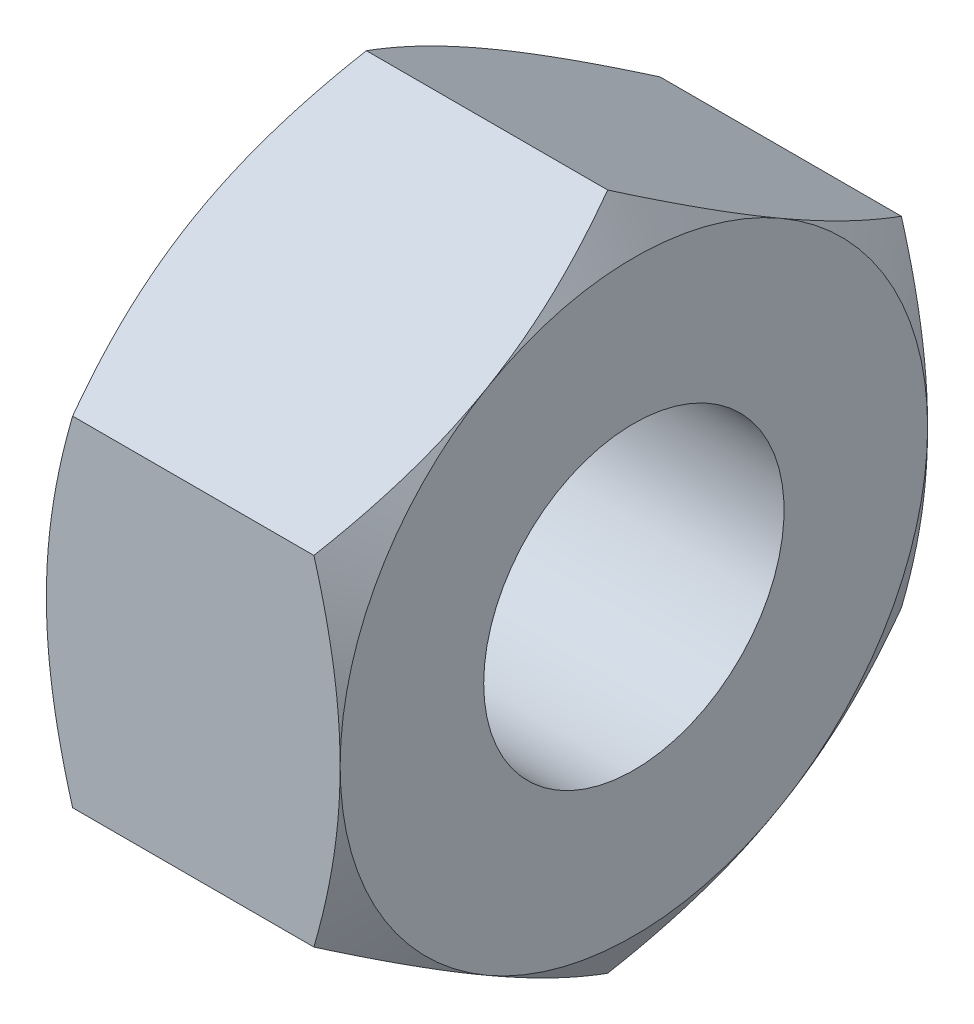
ISO-10303-21;
HEADER;
FILE_DESCRIPTION(('STEP AP214'),'2;1');
FILE_NAME('part.step','',(''),(''),'','','');
FILE_SCHEMA(('AUTOMOTIVE_DESIGN { 1 0 10303 214 1 1 1 1 }'));
ENDSEC;
DATA;
#1=APPLICATION_CONTEXT('core data for automotive mechanical design processes');
#2=APPLICATION_PROTOCOL_DEFINITION('international standard','automotive_design',2000,#1);
#3=PRODUCT_CONTEXT('',#1,'mechanical');
#4=PRODUCT('Part','Part','',(#3));
#5=PRODUCT_RELATED_PRODUCT_CATEGORY('part','',(#4));
#6=PRODUCT_DEFINITION_FORMATION('','',#4);
#7=PRODUCT_DEFINITION_CONTEXT('part definition',#1,'design');
#8=PRODUCT_DEFINITION('design','',#6,#7);
#9=PRODUCT_DEFINITION_SHAPE('','',#8);
#10=(LENGTH_UNIT() NAMED_UNIT(*) SI_UNIT(.MILLI.,.METRE.));
#11=(NAMED_UNIT(*) PLANE_ANGLE_UNIT() SI_UNIT($,.RADIAN.));
#12=(NAMED_UNIT(*) SI_UNIT($,.STERADIAN.) SOLID_ANGLE_UNIT());
#13=UNCERTAINTY_MEASURE_WITH_UNIT(LENGTH_MEASURE(1.E-05),#10,'distance_accuracy_value','');
#14=(GEOMETRIC_REPRESENTATION_CONTEXT(3) GLOBAL_UNCERTAINTY_ASSIGNED_CONTEXT((#13)) GLOBAL_UNIT_ASSIGNED_CONTEXT((#10,
#11,#12)) REPRESENTATION_CONTEXT('',''));
#15=CARTESIAN_POINT('',(0.,0.,0.));
#16=DIRECTION('',(0.,0.,1.));
#17=DIRECTION('',(1.,0.,0.));
#18=AXIS2_PLACEMENT_3D('',#15,#16,#17);
#19=CARTESIAN_POINT('',(6.5,-7.50555349946513,0.));
#20=DIRECTION('',(0.,0.866025403784439,0.5));
#21=DIRECTION('',(0.,-0.5,0.866025403784439));
#22=AXIS2_PLACEMENT_3D('',#19,#20,#21);
#23=PLANE('',#22);
#24=DIRECTION('',(-1.,0.,0.));
#25=VECTOR('',#24,1.);
#26=CARTESIAN_POINT('',(6.5,-3.75277674973257,-6.5));
#27=LINE('',#26,#25);
#28=CARTESIAN_POINT('',(5.91944341639924,-3.75277674973258,-6.5));
#29=VERTEX_POINT('',#28);
#30=CARTESIAN_POINT('',(0.58055658360076,-3.75277674973258,-6.5));
#31=VERTEX_POINT('',#30);
#32=EDGE_CURVE('E168',#29,#31,#27,.T.);
#33=ORIENTED_EDGE('',*,*,#32,.F.);
#34=CARTESIAN_POINT('',(5.91937674819414,-3.75266127967873,-6.5002));
#35=CARTESIAN_POINT('',(5.96699557692452,-3.83515161912751,-6.35732254094112));
#36=CARTESIAN_POINT('',(6.0124532993973,-3.91794952254313,-6.21391236546508));
#37=CARTESIAN_POINT('',(6.09845131797695,-4.08421773795795,-5.9259273686828));
#38=CARTESIAN_POINT('',(6.13898949277197,-4.16768832359106,-5.78135207342873));
#39=CARTESIAN_POINT('',(6.25242899887679,-4.41943655294052,-5.34531134947996));
#40=CARTESIAN_POINT('',(6.31695219287126,-4.5887079340369,-5.05212471715368));
#41=CARTESIAN_POINT('',(6.39261341645251,-4.84201947708215,-4.61337625445562));
#42=CARTESIAN_POINT('',(6.41416714354301,-4.92530276780316,-4.46912536350531));
#43=CARTESIAN_POINT('',(6.45030968539388,-5.09224566542477,-4.17997178286191));
#44=CARTESIAN_POINT('',(6.46489911554033,-5.17590523841628,-4.03506915190111));
#45=CARTESIAN_POINT('',(6.48674124749265,-5.34336968579964,-3.74501222057168));
#46=CARTESIAN_POINT('',(6.49400227567789,-5.427174286676,-3.59985839394579));
#47=CARTESIAN_POINT('',(6.50103969741776,-5.59485627940484,-3.30942466302505));
#48=CARTESIAN_POINT('',(6.50081632218779,-5.6787336689286,-3.16414476276364));
#49=CARTESIAN_POINT('',(6.48991654148483,-5.90853103021317,-2.76612405757351));
#50=CARTESIAN_POINT('',(6.47161818213058,-6.05437578112763,-2.51351353897243));
#51=CARTESIAN_POINT('',(6.41359365854232,-6.34509659313135,-2.00997032176432));
#52=CARTESIAN_POINT('',(6.37384766146175,-6.48997163178545,-1.75903939406692));
#53=CARTESIAN_POINT('',(6.27449409679785,-6.78127752911039,-1.25448277935568));
#54=CARTESIAN_POINT('',(6.21446557436197,-6.92767163007067,-1.00092075856409));
#55=CARTESIAN_POINT('',(6.07822500749013,-7.21827667013277,-0.497578064240954));
#56=CARTESIAN_POINT('',(6.00204496583641,-7.36249133098589,-0.247790944447035));
#57=CARTESIAN_POINT('',(5.91937674819414,-7.50566896951897,0.000200000000000155));
#58=B_SPLINE_CURVE_WITH_KNOTS('',3,(#34,#35,#36,#37,#38,#39,#40,#41,#42,#43,#44,#45,#46,#47,#48,
#49,#50,#51,#52,#53,#54,#55,#56,#57),.UNSPECIFIED.,.F.,.F.,(4,2,2,2,2,2,2,2,2,2,2,4),(0.,
0.515105052395586,1.03043143507524,2.06322554824262,2.56697389547996,3.07067772176453,
3.57380860368927,4.07692394242519,4.9527935470566,5.82947446853466,6.72559912449735,
7.61996451221045),.UNSPECIFIED.);
#59=CARTESIAN_POINT('',(6.5,-5.62916512459885,-3.25));
#60=VERTEX_POINT('',#59);
#61=EDGE_CURVE('E152',#29,#60,#58,.T.);
#62=ORIENTED_EDGE('',*,*,#61,.T.);
#63=CARTESIAN_POINT('',(5.91944341639924,-7.50555349946514,0.));
#64=VERTEX_POINT('',#63);
#65=EDGE_CURVE('E57',#60,#64,#58,.T.);
#66=ORIENTED_EDGE('',*,*,#65,.T.);
#67=DIRECTION('',(-1.,0.,0.));
#68=VECTOR('',#67,1.);
#69=CARTESIAN_POINT('',(6.5,-7.50555349946513,0.));
#70=LINE('',#69,#68);
#71=CARTESIAN_POINT('',(0.58055658360076,-7.50555349946514,0.));
#72=VERTEX_POINT('',#71);
#73=EDGE_CURVE('E163',#64,#72,#70,.T.);
#74=ORIENTED_EDGE('',*,*,#73,.T.);
#75=CARTESIAN_POINT('',(0.580623251805864,-3.75266127967873,-6.5002));
#76=CARTESIAN_POINT('',(0.533004423075483,-3.83515161912751,-6.35732254094112));
#77=CARTESIAN_POINT('',(0.487546700602704,-3.91794952254313,-6.21391236546508));
#78=CARTESIAN_POINT('',(0.401548682023044,-4.08421773795795,-5.9259273686828));
#79=CARTESIAN_POINT('',(0.361010507228024,-4.16768832359106,-5.78135207342873));
#80=CARTESIAN_POINT('',(0.247571001123208,-4.41943655294052,-5.34531134947996));
#81=CARTESIAN_POINT('',(0.18304780712874,-4.5887079340369,-5.05212471715368));
#82=CARTESIAN_POINT('',(0.107386583547493,-4.84201947708215,-4.61337625445563));
#83=CARTESIAN_POINT('',(0.0858328564569899,-4.92530276780316,-4.46912536350531));
#84=CARTESIAN_POINT('',(0.0496903146061218,-5.09224566542477,-4.17997178286191));
#85=CARTESIAN_POINT('',(0.0351008844596692,-5.17590523841628,-4.03506915190111));
#86=CARTESIAN_POINT('',(0.0132587525073493,-5.34336968579964,-3.74501222057168));
#87=CARTESIAN_POINT('',(0.0059977243221104,-5.427174286676,-3.59985839394579));
#88=CARTESIAN_POINT('',(-0.00103969741776594,-5.59485627940484,-3.30942466302505));
#89=CARTESIAN_POINT('',(-0.000816322187792632,-5.6787336689286,-3.16414476276364));
#90=CARTESIAN_POINT('',(0.0100834585151678,-5.90853103021317,-2.76612405757351));
#91=CARTESIAN_POINT('',(0.0283818178694155,-6.05437578112763,-2.51351353897243));
#92=CARTESIAN_POINT('',(0.0864063414576766,-6.34509659313135,-2.00997032176432));
#93=CARTESIAN_POINT('',(0.126152338538246,-6.48997163178544,-1.75903939406692));
#94=CARTESIAN_POINT('',(0.22550590320215,-6.78127752911038,-1.25448277935568));
#95=CARTESIAN_POINT('',(0.285534425638026,-6.92767163007068,-1.00092075856409));
#96=CARTESIAN_POINT('',(0.421774992509866,-7.21827667013277,-0.497578064240955));
#97=CARTESIAN_POINT('',(0.49795503416359,-7.36249133098589,-0.247790944447036));
#98=CARTESIAN_POINT('',(0.580623251805864,-7.50566896951897,0.000200000000000066));
#99=B_SPLINE_CURVE_WITH_KNOTS('',3,(#75,#76,#77,#78,#79,#80,#81,#82,#83,#84,#85,#86,#87,#88,#89,
#90,#91,#92,#93,#94,#95,#96,#97,#98),.UNSPECIFIED.,.F.,.F.,(4,2,2,2,2,2,2,2,2,2,2,4),(0.,
0.515105052395587,1.03043143507524,2.06322554824262,2.56697389547996,3.07067772176453,
3.57380860368927,4.07692394242519,4.95279354705659,5.82947446853466,6.72559912449736,
7.61996451221045),.UNSPECIFIED.);
#100=CARTESIAN_POINT('',(0.,-5.62916512459885,-3.25));
#101=VERTEX_POINT('',#100);
#102=EDGE_CURVE('E208',#101,#72,#99,.T.);
#103=ORIENTED_EDGE('',*,*,#102,.F.);
#104=EDGE_CURVE('E344',#31,#101,#99,.T.);
#105=ORIENTED_EDGE('',*,*,#104,.F.);
#106=EDGE_LOOP('',(#33,#62,#66,#74,#103,#105));
#107=FACE_BOUND('',#106,.T.);
#108=ADVANCED_FACE('F41',(#107),#23,.F.);
#109=CARTESIAN_POINT('',(6.5,-3.75277674973257,-6.5));
#110=DIRECTION('',(0.,0.,1.));
#111=DIRECTION('',(0.,-1.,0.));
#112=AXIS2_PLACEMENT_3D('',#109,#110,#111);
#113=PLANE('',#112);
#114=DIRECTION('',(-1.,0.,0.));
#115=VECTOR('',#114,1.);
#116=CARTESIAN_POINT('',(6.5,3.75277674973257,-6.5));
#117=LINE('',#116,#115);
#118=CARTESIAN_POINT('',(5.91944341639924,3.75277674973257,-6.5));
#119=VERTEX_POINT('',#118);
#120=CARTESIAN_POINT('',(0.58055658360076,3.75277674973257,-6.5));
#121=VERTEX_POINT('',#120);
#122=EDGE_CURVE('E161',#119,#121,#117,.T.);
#123=ORIENTED_EDGE('',*,*,#122,.F.);
#124=CARTESIAN_POINT('',(3.38957529396965,-9.95291930376012,-6.5));
#125=CARTESIAN_POINT('',(3.52748998684855,-9.66753246885864,-6.5));
#126=CARTESIAN_POINT('',(3.66403369342983,-9.38147088338568,-6.5));
#127=CARTESIAN_POINT('',(3.93359570636013,-8.80763337892722,-6.5));
#128=CARTESIAN_POINT('',(4.06661340232531,-8.51985717355029,-6.5));
#129=CARTESIAN_POINT('',(4.32904071112913,-7.94067105260803,-6.5));
#130=CARTESIAN_POINT('',(4.45842532027879,-7.64924976691208,-6.5));
#131=CARTESIAN_POINT('',(4.7116371528739,-7.06401195248325,-6.5));
#132=CARTESIAN_POINT('',(4.8354646660004,-6.77019554954903,-6.5));
#133=CARTESIAN_POINT('',(5.07755469326142,-6.17605277242123,-6.5));
#134=CARTESIAN_POINT('',(5.19573022291758,-5.87569076063596,-6.5));
#135=CARTESIAN_POINT('',(5.42282573681698,-5.27142371161893,-6.5));
#136=CARTESIAN_POINT('',(5.53174469131406,-4.96751828446582,-6.5));
#137=CARTESIAN_POINT('',(5.73740073464719,-4.35630617685149,-6.5));
#138=CARTESIAN_POINT('',(5.83416372207213,-4.04900829883083,-6.5));
#139=CARTESIAN_POINT('',(6.01236415549248,-3.43004071877249,-6.5));
#140=CARTESIAN_POINT('',(6.09380644797263,-3.11837243288824,-6.5));
#141=CARTESIAN_POINT('',(6.23741588566153,-2.49046612743067,-6.5));
#142=CARTESIAN_POINT('',(6.29957789574702,-2.17422691386556,-6.5));
#143=CARTESIAN_POINT('',(6.40042581328225,-1.53789143377902,-6.5));
#144=CARTESIAN_POINT('',(6.43911169999143,-1.21779516385024,-6.5));
#145=CARTESIAN_POINT('',(6.47705347789383,-0.737141364811438,-6.5));
#146=CARTESIAN_POINT('',(6.48635482044178,-0.57733621786633,-6.5));
#147=CARTESIAN_POINT('',(6.49818593157456,-0.257468096283207,-6.5));
#148=CARTESIAN_POINT('',(6.50071578809664,-0.0974051250204134,-6.5));
#149=CARTESIAN_POINT('',(6.49893596916745,0.22263646387025,-6.5));
#150=CARTESIAN_POINT('',(6.49462821320877,0.382615092564559,-6.5));
#151=CARTESIAN_POINT('',(6.47928234207001,0.702251865778322,-6.5));
#152=CARTESIAN_POINT('',(6.46824389078513,0.861909993893739,-6.5));
#153=CARTESIAN_POINT('',(6.43356297867546,1.24887194369331,-6.5));
#154=CARTESIAN_POINT('',(6.40654793642438,1.47587839735562,-6.5));
#155=CARTESIAN_POINT('',(6.34040986127076,1.92815183530151,-6.5));
#156=CARTESIAN_POINT('',(6.30128352350825,2.15341832757691,-6.5));
#157=CARTESIAN_POINT('',(6.21231047705942,2.60202592242475,-6.5));
#158=CARTESIAN_POINT('',(6.16245363219179,2.82536499541634,-6.5));
#159=CARTESIAN_POINT('',(6.05354078051894,3.26974530346816,-6.5));
#160=CARTESIAN_POINT('',(5.99448564031908,3.49078675290536,-6.5));
#161=CARTESIAN_POINT('',(5.86704532562959,3.9360160111231,-6.5));
#162=CARTESIAN_POINT('',(5.79846693486802,4.16014813207211,-6.5));
#163=CARTESIAN_POINT('',(5.65453421659787,4.60604329209093,-6.5));
#164=CARTESIAN_POINT('',(5.5791845627256,4.8278078487957,-6.5));
#165=CARTESIAN_POINT('',(5.42326573854341,5.26807801966739,-6.5));
#166=CARTESIAN_POINT('',(5.34272833440761,5.4865949514202,-6.49999999999999));
#167=CARTESIAN_POINT('',(5.17692644198966,5.921933426937,-6.49999999999999));
#168=CARTESIAN_POINT('',(5.09166004317997,6.13875424450297,-6.49999999999999));
#169=CARTESIAN_POINT('',(5.00449694910844,6.35478737621633,-6.49999999999999));
#170=B_SPLINE_CURVE_WITH_KNOTS('',3,(#124,#125,#126,#127,#128,#129,#130,#131,#132,#133,#134,
#135,#136,#137,#138,#139,#140,#141,#142,#143,#144,#145,#146,#147,#148,#149,#150,#151,#152,#153,
#154,#155,#156,#157,#158,#159,#160,#161,#162,#163,#164,#165,#166,#167,#168,#169),.UNSPECIFIED.,
.F.,.F.,(4,2,2,2,2,2,2,2,2,2,2,2,2,2,2,2,2,2,2,2,2,2,4),(0.,0.950904440030122,1.90197242910012,
2.85848299779176,3.81494364731855,4.78314666613984,5.75145725194119,6.71766851991497,
7.68357362477188,8.64973576896117,9.61589876672907,10.0960037028175,10.5761024040381,
11.0560663531158,11.5360542716923,12.2214972563459,12.9071274458287,13.5934081558082,
14.2796242478146,14.9826609808827,15.685216139834,16.3838168457429,17.0827018739316),.UNSPECIFIED.);
#171=CARTESIAN_POINT('',(6.5,0.,-6.5));
#172=VERTEX_POINT('',#171);
#173=EDGE_CURVE('E285',#119,#172,#170,.F.);
#174=ORIENTED_EDGE('',*,*,#173,.T.);
#175=EDGE_CURVE('E141',#172,#29,#170,.F.);
#176=ORIENTED_EDGE('',*,*,#175,.T.);
#177=ORIENTED_EDGE('',*,*,#32,.T.);
#178=CARTESIAN_POINT('',(3.11042470603036,-9.95291930376012,-6.5));
#179=CARTESIAN_POINT('',(2.97251001315146,-9.66753246885864,-6.5));
#180=CARTESIAN_POINT('',(2.83596630657017,-9.38147088338568,-6.5));
#181=CARTESIAN_POINT('',(2.56640429363987,-8.80763337892722,-6.5));
#182=CARTESIAN_POINT('',(2.4333865976747,-8.51985717355028,-6.5));
#183=CARTESIAN_POINT('',(2.17095928887087,-7.94067105260803,-6.5));
#184=CARTESIAN_POINT('',(2.04157467972122,-7.64924976691208,-6.5));
#185=CARTESIAN_POINT('',(1.7883628471261,-7.06401195248325,-6.5));
#186=CARTESIAN_POINT('',(1.6645353339996,-6.77019554954903,-6.5));
#187=CARTESIAN_POINT('',(1.42244530673858,-6.17605277242123,-6.5));
#188=CARTESIAN_POINT('',(1.30426977708242,-5.87569076063596,-6.5));
#189=CARTESIAN_POINT('',(1.07717426318302,-5.27142371161893,-6.5));
#190=CARTESIAN_POINT('',(0.968255308685941,-4.96751828446582,-6.5));
#191=CARTESIAN_POINT('',(0.762599265352815,-4.35630617685149,-6.5));
#192=CARTESIAN_POINT('',(0.665836277927869,-4.04900829883083,-6.5));
#193=CARTESIAN_POINT('',(0.487635844507524,-3.43004071877249,-6.5));
#194=CARTESIAN_POINT('',(0.406193552027366,-3.11837243288824,-6.5));
#195=CARTESIAN_POINT('',(0.262584114338473,-2.49046612743067,-6.5));
#196=CARTESIAN_POINT('',(0.200422104252976,-2.17422691386556,-6.5));
#197=CARTESIAN_POINT('',(0.0995741867177449,-1.53789143377902,-6.5));
#198=CARTESIAN_POINT('',(0.0608883000085734,-1.21779516385024,-6.5));
#199=CARTESIAN_POINT('',(0.0229465221061728,-0.737141364811437,-6.5));
#200=CARTESIAN_POINT('',(0.0136451795582183,-0.577336217866329,-6.5));
#201=CARTESIAN_POINT('',(0.00181406842544267,-0.257468096283205,-6.5));
#202=CARTESIAN_POINT('',(-0.000715788096643417,-0.0974051250204121,-6.5));
#203=CARTESIAN_POINT('',(0.00106403083255105,0.222636463870252,-6.5));
#204=CARTESIAN_POINT('',(0.00537178679122571,0.382615092564561,-6.5));
#205=CARTESIAN_POINT('',(0.0207176579299883,0.702251865778323,-6.5));
#206=CARTESIAN_POINT('',(0.031756109214864,0.861909993893741,-6.5));
#207=CARTESIAN_POINT('',(0.0664370213245354,1.24887194369331,-6.5));
#208=CARTESIAN_POINT('',(0.0934520635756201,1.47587839735562,-6.5));
#209=CARTESIAN_POINT('',(0.159590138729237,1.92815183530151,-6.5));
#210=CARTESIAN_POINT('',(0.198716476491744,2.1534183275769,-6.5));
#211=CARTESIAN_POINT('',(0.287689522940582,2.60202592242474,-6.5));
#212=CARTESIAN_POINT('',(0.337546367808207,2.82536499541633,-6.5));
#213=CARTESIAN_POINT('',(0.446459219481053,3.26974530346815,-6.5));
#214=CARTESIAN_POINT('',(0.50551435968092,3.49078675290535,-6.5));
#215=CARTESIAN_POINT('',(0.632954674370406,3.93601601112309,-6.5));
#216=CARTESIAN_POINT('',(0.701533065131981,4.1601481320721,-6.5));
#217=CARTESIAN_POINT('',(0.845465783402124,4.60604329209092,-6.5));
#218=CARTESIAN_POINT('',(0.920815437274398,4.82780784879568,-6.5));
#219=CARTESIAN_POINT('',(1.07673426145659,5.26807801966737,-6.5));
#220=CARTESIAN_POINT('',(1.15727166559238,5.48659495142018,-6.49999999999999));
#221=CARTESIAN_POINT('',(1.32307355801033,5.92193342693698,-6.49999999999999));
#222=CARTESIAN_POINT('',(1.40833995682003,6.13875424450295,-6.49999999999999));
#223=CARTESIAN_POINT('',(1.49550305089155,6.35478737621631,-6.49999999999999));
#224=B_SPLINE_CURVE_WITH_KNOTS('',3,(#178,#179,#180,#181,#182,#183,#184,#185,#186,#187,#188,
#189,#190,#191,#192,#193,#194,#195,#196,#197,#198,#199,#200,#201,#202,#203,#204,#205,#206,#207,
#208,#209,#210,#211,#212,#213,#214,#215,#216,#217,#218,#219,#220,#221,#222,#223),.UNSPECIFIED.,
.F.,.F.,(4,2,2,2,2,2,2,2,2,2,2,2,2,2,2,2,2,2,2,2,2,2,4),(0.,0.950904440030123,1.90197242910012,
2.85848299779176,3.81494364731856,4.78314666613984,5.75145725194119,6.71766851991497,
7.68357362477189,8.64973576896118,9.61589876672908,10.0960037028175,10.5761024040381,
11.0560663531158,11.5360542716923,12.2214972563459,12.9071274458287,13.5934081558082,
14.2796242478146,14.9826609808827,15.685216139834,16.3838168457429,17.0827018739316),.UNSPECIFIED.);
#225=CARTESIAN_POINT('',(0.,0.,-6.5));
#226=VERTEX_POINT('',#225);
#227=EDGE_CURVE('E260',#226,#31,#224,.F.);
#228=ORIENTED_EDGE('',*,*,#227,.F.);
#229=EDGE_CURVE('E265',#121,#226,#224,.F.);
#230=ORIENTED_EDGE('',*,*,#229,.F.);
#231=EDGE_LOOP('',(#123,#174,#176,#177,#228,#230));
#232=FACE_BOUND('',#231,.T.);
#233=ADVANCED_FACE('F272',(#232),#113,.F.);
#234=CARTESIAN_POINT('',(6.5,3.75277674973257,-6.5));
#235=DIRECTION('',(0.,-0.866025403784439,0.5));
#236=DIRECTION('',(0.,-0.5,-0.866025403784439));
#237=AXIS2_PLACEMENT_3D('',#234,#235,#236);
#238=PLANE('',#237);
#239=DIRECTION('',(-1.,0.,0.));
#240=VECTOR('',#239,1.);
#241=CARTESIAN_POINT('',(6.5,7.50555349946514,0.));
#242=LINE('',#241,#240);
#243=CARTESIAN_POINT('',(5.91944341639924,7.50555349946514,0.));
#244=VERTEX_POINT('',#243);
#245=CARTESIAN_POINT('',(0.58055658360076,7.50555349946514,0.));
#246=VERTEX_POINT('',#245);
#247=EDGE_CURVE('E158',#244,#246,#242,.T.);
#248=ORIENTED_EDGE('',*,*,#247,.F.);
#249=CARTESIAN_POINT('',(5.91937674819414,7.50566896951897,0.000200000000000071));
#250=CARTESIAN_POINT('',(5.96699557692452,7.4231786300702,-0.14267745905888));
#251=CARTESIAN_POINT('',(6.0124532993973,7.34038072665458,-0.286087634534913));
#252=CARTESIAN_POINT('',(6.09845131797695,7.17411251123976,-0.574072631317194));
#253=CARTESIAN_POINT('',(6.13898949277197,7.09064192560665,-0.718647926571263));
#254=CARTESIAN_POINT('',(6.25242899887679,6.83889369625719,-1.15468865052003));
#255=CARTESIAN_POINT('',(6.31695219287126,6.66962231516081,-1.44787528284632));
#256=CARTESIAN_POINT('',(6.39261341645251,6.41631077211555,-1.88662374554437));
#257=CARTESIAN_POINT('',(6.41416714354301,6.33302748139455,-2.03087463649469));
#258=CARTESIAN_POINT('',(6.45030968539388,6.16608458377294,-2.32002821713809));
#259=CARTESIAN_POINT('',(6.46489911554033,6.08242501078143,-2.46493084809889));
#260=CARTESIAN_POINT('',(6.48674124749265,5.91496056339807,-2.75498777942832));
#261=CARTESIAN_POINT('',(6.49400227567789,5.83115596252171,-2.90014160605421));
#262=CARTESIAN_POINT('',(6.50103969741776,5.66347396979287,-3.19057533697494));
#263=CARTESIAN_POINT('',(6.50081632218779,5.5795965802691,-3.33585523723635));
#264=CARTESIAN_POINT('',(6.48991654148483,5.34979921898454,-3.73387594242649));
#265=CARTESIAN_POINT('',(6.47161818213058,5.20395446807007,-3.98648646102757));
#266=CARTESIAN_POINT('',(6.41359365854232,4.91323365606636,-4.49002967823567));
#267=CARTESIAN_POINT('',(6.37384766146175,4.76835861741226,-4.74096060593308));
#268=CARTESIAN_POINT('',(6.27449409679785,4.47705272008732,-5.24551722064432));
#269=CARTESIAN_POINT('',(6.21446557436197,4.33065861912703,-5.49907924143591));
#270=CARTESIAN_POINT('',(6.07822500749013,4.04005357906494,-6.00242193575904));
#271=CARTESIAN_POINT('',(6.00204496583641,3.89583891821182,-6.25220905555296));
#272=CARTESIAN_POINT('',(5.91937674819414,3.75266127967873,-6.50019999999999));
#273=B_SPLINE_CURVE_WITH_KNOTS('',3,(#249,#250,#251,#252,#253,#254,#255,#256,#257,#258,#259,
#260,#261,#262,#263,#264,#265,#266,#267,#268,#269,#270,#271,#272),.UNSPECIFIED.,.F.,.F.,(4,2,2,
2,2,2,2,2,2,2,2,4),(0.,0.515105052395587,1.03043143507524,2.06322554824262,2.56697389547996,
3.07067772176453,3.57380860368927,4.07692394242519,4.95279354705659,5.82947446853465,
6.72559912449735,7.61996451221045),.UNSPECIFIED.);
#274=CARTESIAN_POINT('',(6.5,5.62916512459885,-3.25));
#275=VERTEX_POINT('',#274);
#276=EDGE_CURVE('E214',#244,#275,#273,.T.);
#277=ORIENTED_EDGE('',*,*,#276,.T.);
#278=EDGE_CURVE('E291',#275,#119,#273,.T.);
#279=ORIENTED_EDGE('',*,*,#278,.T.);
#280=ORIENTED_EDGE('',*,*,#122,.T.);
#281=CARTESIAN_POINT('',(0.580623251805864,7.50566896951897,0.0002000000000001));
#282=CARTESIAN_POINT('',(0.533004423075483,7.4231786300702,-0.14267745905888));
#283=CARTESIAN_POINT('',(0.487546700602704,7.34038072665458,-0.286087634534913));
#284=CARTESIAN_POINT('',(0.401548682023045,7.17411251123976,-0.574072631317195));
#285=CARTESIAN_POINT('',(0.361010507228025,7.09064192560665,-0.718647926571264));
#286=CARTESIAN_POINT('',(0.247571001123209,6.83889369625719,-1.15468865052003));
#287=CARTESIAN_POINT('',(0.18304780712874,6.66962231516081,-1.44787528284632));
#288=CARTESIAN_POINT('',(0.107386583547493,6.41631077211555,-1.88662374554437));
#289=CARTESIAN_POINT('',(0.0858328564569888,6.33302748139454,-2.03087463649469));
#290=CARTESIAN_POINT('',(0.0496903146061209,6.16608458377293,-2.32002821713809));
#291=CARTESIAN_POINT('',(0.035100884459669,6.08242501078143,-2.46493084809889));
#292=CARTESIAN_POINT('',(0.0132587525073496,5.91496056339807,-2.75498777942832));
#293=CARTESIAN_POINT('',(0.00599772432211049,5.8311559625217,-2.90014160605421));
#294=CARTESIAN_POINT('',(-0.00103969741776601,5.66347396979287,-3.19057533697495));
#295=CARTESIAN_POINT('',(-0.00081632218779273,5.5795965802691,-3.33585523723636));
#296=CARTESIAN_POINT('',(0.0100834585151677,5.34979921898453,-3.73387594242649));
#297=CARTESIAN_POINT('',(0.0283818178694154,5.20395446807007,-3.98648646102757));
#298=CARTESIAN_POINT('',(0.0864063414576762,4.91323365606636,-4.49002967823568));
#299=CARTESIAN_POINT('',(0.126152338538245,4.76835861741226,-4.74096060593308));
#300=CARTESIAN_POINT('',(0.225505903202149,4.47705272008732,-5.24551722064432));
#301=CARTESIAN_POINT('',(0.285534425638025,4.33065861912703,-5.49907924143591));
#302=CARTESIAN_POINT('',(0.421774992509866,4.04005357906494,-6.00242193575904));
#303=CARTESIAN_POINT('',(0.497955034163589,3.89583891821182,-6.25220905555296));
#304=CARTESIAN_POINT('',(0.580623251805863,3.75266127967873,-6.5002));
#305=B_SPLINE_CURVE_WITH_KNOTS('',3,(#281,#282,#283,#284,#285,#286,#287,#288,#289,#290,#291,
#292,#293,#294,#295,#296,#297,#298,#299,#300,#301,#302,#303,#304),.UNSPECIFIED.,.F.,.F.,(4,2,2,
2,2,2,2,2,2,2,2,4),(0.,0.515105052395587,1.03043143507524,2.06322554824262,2.56697389547996,
3.07067772176453,3.57380860368927,4.0769239424252,4.9527935470566,5.82947446853466,
6.72559912449736,7.61996451221045),.UNSPECIFIED.);
#306=CARTESIAN_POINT('',(0.,5.62916512459885,-3.25));
#307=VERTEX_POINT('',#306);
#308=EDGE_CURVE('E266',#307,#121,#305,.T.);
#309=ORIENTED_EDGE('',*,*,#308,.F.);
#310=EDGE_CURVE('E352',#246,#307,#305,.T.);
#311=ORIENTED_EDGE('',*,*,#310,.F.);
#312=EDGE_LOOP('',(#248,#277,#279,#280,#309,#311));
#313=FACE_BOUND('',#312,.T.);
#314=ADVANCED_FACE('F275',(#313),#238,.F.);
#315=CARTESIAN_POINT('',(6.5,7.50555349946514,0.));
#316=DIRECTION('',(0.,-0.866025403784439,-0.5));
#317=DIRECTION('',(0.,0.5,-0.866025403784439));
#318=AXIS2_PLACEMENT_3D('',#315,#316,#317);
#319=PLANE('',#318);
#320=DIRECTION('',(-1.,0.,0.));
#321=VECTOR('',#320,1.);
#322=CARTESIAN_POINT('',(6.5,3.75277674973257,6.5));
#323=LINE('',#322,#321);
#324=CARTESIAN_POINT('',(5.91944341639924,3.75277674973257,6.5));
#325=VERTEX_POINT('',#324);
#326=CARTESIAN_POINT('',(0.58055658360076,3.75277674973257,6.5));
#327=VERTEX_POINT('',#326);
#328=EDGE_CURVE('E149',#325,#327,#323,.T.);
#329=ORIENTED_EDGE('',*,*,#328,.F.);
#330=CARTESIAN_POINT('',(5.91937674819414,3.75266127967873,6.5002));
#331=CARTESIAN_POINT('',(5.96699557692452,3.83515161912751,6.35732254094112));
#332=CARTESIAN_POINT('',(6.0124532993973,3.91794952254312,6.21391236546509));
#333=CARTESIAN_POINT('',(6.09845131797695,4.08421773795795,5.92592736868281));
#334=CARTESIAN_POINT('',(6.13898949277197,4.16768832359106,5.78135207342874));
#335=CARTESIAN_POINT('',(6.25242899887679,4.41943655294052,5.34531134947997));
#336=CARTESIAN_POINT('',(6.31695219287126,4.5887079340369,5.05212471715368));
#337=CARTESIAN_POINT('',(6.3926134164525,4.84201947708215,4.61337625445563));
#338=CARTESIAN_POINT('',(6.41416714354301,4.92530276780316,4.46912536350531));
#339=CARTESIAN_POINT('',(6.45030968539388,5.09224566542477,4.17997178286191));
#340=CARTESIAN_POINT('',(6.46489911554033,5.17590523841627,4.03506915190111));
#341=CARTESIAN_POINT('',(6.48674124749265,5.34336968579964,3.74501222057168));
#342=CARTESIAN_POINT('',(6.49400227567789,5.427174286676,3.59985839394579));
#343=CARTESIAN_POINT('',(6.50103969741776,5.59485627940484,3.30942466302505));
#344=CARTESIAN_POINT('',(6.50081632218779,5.6787336689286,3.16414476276365));
#345=CARTESIAN_POINT('',(6.48991654148483,5.90853103021317,2.76612405757351));
#346=CARTESIAN_POINT('',(6.47161818213058,6.05437578112763,2.51351353897243));
#347=CARTESIAN_POINT('',(6.41359365854232,6.34509659313135,2.00997032176432));
#348=CARTESIAN_POINT('',(6.37384766146175,6.48997163178544,1.75903939406692));
#349=CARTESIAN_POINT('',(6.27449409679785,6.78127752911038,1.25448277935568));
#350=CARTESIAN_POINT('',(6.21446557436197,6.92767163007067,1.00092075856409));
#351=CARTESIAN_POINT('',(6.07822500749013,7.21827667013277,0.497578064240957));
#352=CARTESIAN_POINT('',(6.00204496583641,7.36249133098589,0.247790944447037));
#353=CARTESIAN_POINT('',(5.91937674819414,7.50566896951897,-0.000199999999999004));
#354=B_SPLINE_CURVE_WITH_KNOTS('',3,(#330,#331,#332,#333,#334,#335,#336,#337,#338,#339,#340,
#341,#342,#343,#344,#345,#346,#347,#348,#349,#350,#351,#352,#353),.UNSPECIFIED.,.F.,.F.,(4,2,2,
2,2,2,2,2,2,2,2,4),(0.,0.515105052395586,1.03043143507524,2.06322554824262,2.56697389547996,
3.07067772176453,3.57380860368927,4.07692394242519,4.9527935470566,5.82947446853466,
6.72559912449736,7.61996451221045),.UNSPECIFIED.);
#355=CARTESIAN_POINT('',(6.5,5.62916512459885,3.25));
#356=VERTEX_POINT('',#355);
#357=EDGE_CURVE('E131',#325,#356,#354,.T.);
#358=ORIENTED_EDGE('',*,*,#357,.T.);
#359=EDGE_CURVE('E143',#356,#244,#354,.T.);
#360=ORIENTED_EDGE('',*,*,#359,.T.);
#361=ORIENTED_EDGE('',*,*,#247,.T.);
#362=CARTESIAN_POINT('',(0.580623251805865,3.75266127967873,6.5002));
#363=CARTESIAN_POINT('',(0.533004423075483,3.83515161912751,6.35732254094112));
#364=CARTESIAN_POINT('',(0.487546700602705,3.91794952254313,6.21391236546509));
#365=CARTESIAN_POINT('',(0.401548682023045,4.08421773795795,5.9259273686828));
#366=CARTESIAN_POINT('',(0.361010507228025,4.16768832359106,5.78135207342874));
#367=CARTESIAN_POINT('',(0.247571001123209,4.41943655294052,5.34531134947997));
#368=CARTESIAN_POINT('',(0.183047807128741,4.5887079340369,5.05212471715368));
#369=CARTESIAN_POINT('',(0.107386583547494,4.84201947708215,4.61337625445563));
#370=CARTESIAN_POINT('',(0.0858328564569903,4.92530276780316,4.46912536350531));
#371=CARTESIAN_POINT('',(0.0496903146061219,5.09224566542477,4.17997178286191));
#372=CARTESIAN_POINT('',(0.0351008844596694,5.17590523841628,4.03506915190111));
#373=CARTESIAN_POINT('',(0.0132587525073497,5.34336968579964,3.74501222057168));
#374=CARTESIAN_POINT('',(0.005997724322111,5.427174286676,3.59985839394579));
#375=CARTESIAN_POINT('',(-0.00103969741776528,5.59485627940484,3.30942466302505));
#376=CARTESIAN_POINT('',(-0.000816322187792131,5.6787336689286,3.16414476276364));
#377=CARTESIAN_POINT('',(0.010083458515168,5.90853103021317,2.76612405757351));
#378=CARTESIAN_POINT('',(0.0283818178694157,6.05437578112763,2.51351353897243));
#379=CARTESIAN_POINT('',(0.0864063414576769,6.34509659313135,2.00997032176432));
#380=CARTESIAN_POINT('',(0.126152338538246,6.48997163178545,1.75903939406692));
#381=CARTESIAN_POINT('',(0.22550590320215,6.78127752911039,1.25448277935568));
#382=CARTESIAN_POINT('',(0.285534425638027,6.92767163007068,1.00092075856409));
#383=CARTESIAN_POINT('',(0.421774992509867,7.21827667013277,0.497578064240954));
#384=CARTESIAN_POINT('',(0.497955034163591,7.36249133098589,0.247790944447035));
#385=CARTESIAN_POINT('',(0.580623251805865,7.50566896951897,-0.000200000000000924));
#386=B_SPLINE_CURVE_WITH_KNOTS('',3,(#362,#363,#364,#365,#366,#367,#368,#369,#370,#371,#372,
#373,#374,#375,#376,#377,#378,#379,#380,#381,#382,#383,#384,#385),.UNSPECIFIED.,.F.,.F.,(4,2,2,
2,2,2,2,2,2,2,2,4),(0.,0.515105052395588,1.03043143507524,2.06322554824262,2.56697389547996,
3.07067772176453,3.57380860368927,4.0769239424252,4.9527935470566,5.82947446853466,
6.72559912449736,7.61996451221046),.UNSPECIFIED.);
#387=CARTESIAN_POINT('',(0.,5.62916512459885,3.25));
#388=VERTEX_POINT('',#387);
#389=EDGE_CURVE('E350',#388,#246,#386,.T.);
#390=ORIENTED_EDGE('',*,*,#389,.F.);
#391=EDGE_CURVE('E157',#327,#388,#386,.T.);
#392=ORIENTED_EDGE('',*,*,#391,.F.);
#393=EDGE_LOOP('',(#329,#358,#360,#361,#390,#392));
#394=FACE_BOUND('',#393,.T.);
#395=ADVANCED_FACE('F155',(#394),#319,.F.);
#396=CARTESIAN_POINT('',(6.5,3.75277674973257,6.5));
#397=DIRECTION('',(0.,0.,-1.));
#398=DIRECTION('',(0.,1.,0.));
#399=AXIS2_PLACEMENT_3D('',#396,#397,#398);
#400=PLANE('',#399);
#401=DIRECTION('',(-1.,0.,0.));
#402=VECTOR('',#401,1.);
#403=CARTESIAN_POINT('',(6.5,-3.75277674973257,6.5));
#404=LINE('',#403,#402);
#405=CARTESIAN_POINT('',(5.91944341639924,-3.75277674973257,6.5));
#406=VERTEX_POINT('',#405);
#407=CARTESIAN_POINT('',(0.58055658360076,-3.75277674973257,6.5));
#408=VERTEX_POINT('',#407);
#409=EDGE_CURVE('E159',#406,#408,#404,.T.);
#410=ORIENTED_EDGE('',*,*,#409,.F.);
#411=CARTESIAN_POINT('',(3.38957529396965,-9.95291930376012,6.5));
#412=CARTESIAN_POINT('',(3.52748998684855,-9.66753246885864,6.5));
#413=CARTESIAN_POINT('',(3.66403369342983,-9.38147088338568,6.5));
#414=CARTESIAN_POINT('',(3.93359570636013,-8.80763337892722,6.5));
#415=CARTESIAN_POINT('',(4.06661340232531,-8.51985717355028,6.5));
#416=CARTESIAN_POINT('',(4.32904071112913,-7.94067105260803,6.5));
#417=CARTESIAN_POINT('',(4.45842532027879,-7.64924976691208,6.5));
#418=CARTESIAN_POINT('',(4.7116371528739,-7.06401195248325,6.5));
#419=CARTESIAN_POINT('',(4.8354646660004,-6.77019554954903,6.5));
#420=CARTESIAN_POINT('',(5.07755469326142,-6.17605277242122,6.5));
#421=CARTESIAN_POINT('',(5.19573022291758,-5.87569076063596,6.5));
#422=CARTESIAN_POINT('',(5.42282573681698,-5.27142371161893,6.5));
#423=CARTESIAN_POINT('',(5.53174469131406,-4.96751828446581,6.5));
#424=CARTESIAN_POINT('',(5.73740073464718,-4.35630617685149,6.5));
#425=CARTESIAN_POINT('',(5.83416372207213,-4.04900829883083,6.5));
#426=CARTESIAN_POINT('',(6.01236415549247,-3.43004071877248,6.5));
#427=CARTESIAN_POINT('',(6.09380644797263,-3.11837243288824,6.5));
#428=CARTESIAN_POINT('',(6.23741588566152,-2.49046612743066,6.5));
#429=CARTESIAN_POINT('',(6.29957789574702,-2.17422691386555,6.5));
#430=CARTESIAN_POINT('',(6.40042581328225,-1.53789143377901,6.5));
#431=CARTESIAN_POINT('',(6.43911169999142,-1.21779516385023,6.5));
#432=CARTESIAN_POINT('',(6.47705347789382,-0.737141364811433,6.5));
#433=CARTESIAN_POINT('',(6.48635482044178,-0.577336217866325,6.5));
#434=CARTESIAN_POINT('',(6.49818593157455,-0.257468096283201,6.5));
#435=CARTESIAN_POINT('',(6.50071578809664,-0.0974051250204074,6.5));
#436=CARTESIAN_POINT('',(6.49893596916744,0.222636463870257,6.5));
#437=CARTESIAN_POINT('',(6.49462821320877,0.382615092564565,6.5));
#438=CARTESIAN_POINT('',(6.47928234207001,0.702251865778328,6.5));
#439=CARTESIAN_POINT('',(6.46824389078513,0.861909993893746,6.5));
#440=CARTESIAN_POINT('',(6.43356297867546,1.24887194369332,6.5));
#441=CARTESIAN_POINT('',(6.40654793642437,1.47587839735563,6.5));
#442=CARTESIAN_POINT('',(6.34040986127076,1.92815183530152,6.5));
#443=CARTESIAN_POINT('',(6.30128352350825,2.15341832757691,6.5));
#444=CARTESIAN_POINT('',(6.21231047705941,2.60202592242475,6.5));
#445=CARTESIAN_POINT('',(6.16245363219179,2.82536499541635,6.5));
#446=CARTESIAN_POINT('',(6.05354078051894,3.26974530346817,6.5));
#447=CARTESIAN_POINT('',(5.99448564031907,3.49078675290537,6.5));
#448=CARTESIAN_POINT('',(5.86704532562959,3.93601601112311,6.5));
#449=CARTESIAN_POINT('',(5.79846693486801,4.16014813207212,6.5));
#450=CARTESIAN_POINT('',(5.65453421659787,4.60604329209094,6.5));
#451=CARTESIAN_POINT('',(5.57918456272559,4.82780784879571,6.5));
#452=CARTESIAN_POINT('',(5.4232657385434,5.2680780196674,6.5));
#453=CARTESIAN_POINT('',(5.3427283344076,5.48659495142021,6.5));
#454=CARTESIAN_POINT('',(5.17692644198965,5.92193342693702,6.5));
#455=CARTESIAN_POINT('',(5.09166004317996,6.13875424450299,6.5));
#456=CARTESIAN_POINT('',(5.00449694910843,6.35478737621634,6.5));
#457=B_SPLINE_CURVE_WITH_KNOTS('',3,(#411,#412,#413,#414,#415,#416,#417,#418,#419,#420,#421,
#422,#423,#424,#425,#426,#427,#428,#429,#430,#431,#432,#433,#434,#435,#436,#437,#438,#439,#440,
#441,#442,#443,#444,#445,#446,#447,#448,#449,#450,#451,#452,#453,#454,#455,#456),.UNSPECIFIED.,
.F.,.F.,(4,2,2,2,2,2,2,2,2,2,2,2,2,2,2,2,2,2,2,2,2,2,4),(0.,0.950904440030122,1.90197242910012,
2.85848299779176,3.81494364731856,4.78314666613984,5.75145725194119,6.71766851991497,
7.68357362477189,8.64973576896118,9.61589876672908,10.0960037028175,10.5761024040381,
11.0560663531158,11.5360542716923,12.2214972563459,12.9071274458288,13.5934081558082,
14.2796242478146,14.9826609808827,15.685216139834,16.3838168457429,17.0827018739316),.UNSPECIFIED.);
#458=CARTESIAN_POINT('',(6.5,0.,6.5));
#459=VERTEX_POINT('',#458);
#460=EDGE_CURVE('E151',#406,#459,#457,.T.);
#461=ORIENTED_EDGE('',*,*,#460,.T.);
#462=EDGE_CURVE('E134',#459,#325,#457,.T.);
#463=ORIENTED_EDGE('',*,*,#462,.T.);
#464=ORIENTED_EDGE('',*,*,#328,.T.);
#465=CARTESIAN_POINT('',(3.11042470603036,-9.95291930376012,6.5));
#466=CARTESIAN_POINT('',(2.97251001315146,-9.66753246885863,6.5));
#467=CARTESIAN_POINT('',(2.83596630657018,-9.38147088338568,6.5));
#468=CARTESIAN_POINT('',(2.56640429363987,-8.80763337892722,6.5));
#469=CARTESIAN_POINT('',(2.4333865976747,-8.51985717355028,6.5));
#470=CARTESIAN_POINT('',(2.17095928887087,-7.94067105260803,6.5));
#471=CARTESIAN_POINT('',(2.04157467972122,-7.64924976691208,6.5));
#472=CARTESIAN_POINT('',(1.78836284712611,-7.06401195248324,6.5));
#473=CARTESIAN_POINT('',(1.6645353339996,-6.77019554954902,6.5));
#474=CARTESIAN_POINT('',(1.42244530673858,-6.17605277242123,6.5));
#475=CARTESIAN_POINT('',(1.30426977708242,-5.87569076063596,6.5));
#476=CARTESIAN_POINT('',(1.07717426318302,-5.27142371161892,6.5));
#477=CARTESIAN_POINT('',(0.968255308685942,-4.96751828446581,6.5));
#478=CARTESIAN_POINT('',(0.762599265352816,-4.35630617685149,6.5));
#479=CARTESIAN_POINT('',(0.665836277927871,-4.04900829883083,6.5));
#480=CARTESIAN_POINT('',(0.487635844507526,-3.43004071877248,6.5));
#481=CARTESIAN_POINT('',(0.406193552027367,-3.11837243288823,6.5));
#482=CARTESIAN_POINT('',(0.262584114338475,-2.49046612743066,6.5));
#483=CARTESIAN_POINT('',(0.200422104252978,-2.17422691386555,6.5));
#484=CARTESIAN_POINT('',(0.0995741867177468,-1.53789143377901,6.5));
#485=CARTESIAN_POINT('',(0.0608883000085748,-1.21779516385023,6.5));
#486=CARTESIAN_POINT('',(0.0229465221061751,-0.73714136481143,6.5));
#487=CARTESIAN_POINT('',(0.0136451795582211,-0.577336217866322,6.5));
#488=CARTESIAN_POINT('',(0.00181406842544587,-0.257468096283198,6.5));
#489=CARTESIAN_POINT('',(-0.00071578809664035,-0.097405125020405,6.5));
#490=CARTESIAN_POINT('',(0.00106403083255399,0.222636463870259,6.5));
#491=CARTESIAN_POINT('',(0.00537178679122864,0.382615092564567,6.5));
#492=CARTESIAN_POINT('',(0.0207176579299914,0.70225186577833,6.5));
#493=CARTESIAN_POINT('',(0.0317561092148674,0.861909993893747,6.5));
#494=CARTESIAN_POINT('',(0.0664370213245392,1.24887194369332,6.5));
#495=CARTESIAN_POINT('',(0.093452063575624,1.47587839735563,6.5));
#496=CARTESIAN_POINT('',(0.159590138729242,1.92815183530151,6.5));
#497=CARTESIAN_POINT('',(0.198716476491749,2.15341832757691,6.5));
#498=CARTESIAN_POINT('',(0.287689522940587,2.60202592242475,6.5));
#499=CARTESIAN_POINT('',(0.337546367808212,2.82536499541634,6.5));
#500=CARTESIAN_POINT('',(0.446459219481058,3.26974530346815,6.5));
#501=CARTESIAN_POINT('',(0.505514359680925,3.49078675290536,6.5));
#502=CARTESIAN_POINT('',(0.632954674370411,3.9360160111231,6.5));
#503=CARTESIAN_POINT('',(0.701533065131986,4.16014813207211,6.5));
#504=CARTESIAN_POINT('',(0.84546578340213,4.60604329209093,6.5));
#505=CARTESIAN_POINT('',(0.920815437274405,4.82780784879569,6.5));
#506=CARTESIAN_POINT('',(1.07673426145659,5.26807801966739,6.5));
#507=CARTESIAN_POINT('',(1.15727166559239,5.48659495142019,6.5));
#508=CARTESIAN_POINT('',(1.32307355801034,5.92193342693699,6.5));
#509=CARTESIAN_POINT('',(1.40833995682003,6.13875424450297,6.5));
#510=CARTESIAN_POINT('',(1.49550305089156,6.35478737621632,6.5));
#511=B_SPLINE_CURVE_WITH_KNOTS('',3,(#465,#466,#467,#468,#469,#470,#471,#472,#473,#474,#475,
#476,#477,#478,#479,#480,#481,#482,#483,#484,#485,#486,#487,#488,#489,#490,#491,#492,#493,#494,
#495,#496,#497,#498,#499,#500,#501,#502,#503,#504,#505,#506,#507,#508,#509,#510),.UNSPECIFIED.,
.F.,.F.,(4,2,2,2,2,2,2,2,2,2,2,2,2,2,2,2,2,2,2,2,2,2,4),(0.,0.950904440030121,1.90197242910012,
2.85848299779176,3.81494364731856,4.78314666613984,5.75145725194119,6.71766851991497,
7.68357362477189,8.64973576896118,9.61589876672908,10.0960037028175,10.5761024040381,
11.0560663531158,11.5360542716923,12.2214972563459,12.9071274458287,13.5934081558082,
14.2796242478146,14.9826609808827,15.685216139834,16.3838168457429,17.0827018739316),.UNSPECIFIED.);
#512=CARTESIAN_POINT('',(0.,0.,6.5));
#513=VERTEX_POINT('',#512);
#514=EDGE_CURVE('E347',#513,#327,#511,.T.);
#515=ORIENTED_EDGE('',*,*,#514,.F.);
#516=EDGE_CURVE('E199',#408,#513,#511,.T.);
#517=ORIENTED_EDGE('',*,*,#516,.F.);
#518=EDGE_LOOP('',(#410,#461,#463,#464,#515,#517));
#519=FACE_BOUND('',#518,.T.);
#520=ADVANCED_FACE('F147',(#519),#400,.F.);
#521=CARTESIAN_POINT('',(6.5,-3.75277674973257,6.5));
#522=DIRECTION('',(0.,0.866025403784439,-0.5));
#523=DIRECTION('',(0.,0.5,0.866025403784439));
#524=AXIS2_PLACEMENT_3D('',#521,#522,#523);
#525=PLANE('',#524);
#526=ORIENTED_EDGE('',*,*,#73,.F.);
#527=CARTESIAN_POINT('',(5.91937674819414,-7.50566896951897,-0.000199999999999899));
#528=CARTESIAN_POINT('',(5.96699557692452,-7.4231786300702,0.14267745905888));
#529=CARTESIAN_POINT('',(6.0124532993973,-7.34038072665458,0.286087634534913));
#530=CARTESIAN_POINT('',(6.09845131797696,-7.17411251123975,0.574072631317195));
#531=CARTESIAN_POINT('',(6.13898949277198,-7.09064192560665,0.718647926571264));
#532=CARTESIAN_POINT('',(6.25242899887679,-6.83889369625719,1.15468865052003));
#533=CARTESIAN_POINT('',(6.31695219287126,-6.66962231516081,1.44787528284632));
#534=CARTESIAN_POINT('',(6.39261341645251,-6.41631077211555,1.88662374554437));
#535=CARTESIAN_POINT('',(6.41416714354301,-6.33302748139454,2.03087463649469));
#536=CARTESIAN_POINT('',(6.45030968539388,-6.16608458377293,2.32002821713809));
#537=CARTESIAN_POINT('',(6.46489911554033,-6.08242501078143,2.46493084809889));
#538=CARTESIAN_POINT('',(6.48674124749265,-5.91496056339807,2.75498777942832));
#539=CARTESIAN_POINT('',(6.49400227567789,-5.8311559625217,2.90014160605421));
#540=CARTESIAN_POINT('',(6.50103969741776,-5.66347396979287,3.19057533697495));
#541=CARTESIAN_POINT('',(6.50081632218779,-5.5795965802691,3.33585523723635));
#542=CARTESIAN_POINT('',(6.48991654148483,-5.34979921898453,3.73387594242649));
#543=CARTESIAN_POINT('',(6.47161818213058,-5.20395446807007,3.98648646102757));
#544=CARTESIAN_POINT('',(6.41359365854232,-4.91323365606636,4.49002967823568));
#545=CARTESIAN_POINT('',(6.37384766146175,-4.76835861741226,4.74096060593308));
#546=CARTESIAN_POINT('',(6.27449409679785,-4.47705272008732,5.24551722064432));
#547=CARTESIAN_POINT('',(6.21446557436197,-4.33065861912703,5.49907924143591));
#548=CARTESIAN_POINT('',(6.07822500749013,-4.04005357906493,6.00242193575905));
#549=CARTESIAN_POINT('',(6.00204496583641,-3.89583891821181,6.25220905555297));
#550=CARTESIAN_POINT('',(5.91937674819414,-3.75266127967873,6.5002));
#551=B_SPLINE_CURVE_WITH_KNOTS('',3,(#527,#528,#529,#530,#531,#532,#533,#534,#535,#536,#537,
#538,#539,#540,#541,#542,#543,#544,#545,#546,#547,#548,#549,#550),.UNSPECIFIED.,.F.,.F.,(4,2,2,
2,2,2,2,2,2,2,2,4),(0.,0.515105052395587,1.03043143507524,2.06322554824262,2.56697389547996,
3.07067772176453,3.57380860368927,4.07692394242519,4.9527935470566,5.82947446853466,
6.72559912449736,7.61996451221045),.UNSPECIFIED.);
#552=CARTESIAN_POINT('',(6.5,-5.62916512459885,3.25));
#553=VERTEX_POINT('',#552);
#554=EDGE_CURVE('E325',#64,#553,#551,.T.);
#555=ORIENTED_EDGE('',*,*,#554,.T.);
#556=EDGE_CURVE('E64',#553,#406,#551,.T.);
#557=ORIENTED_EDGE('',*,*,#556,.T.);
#558=ORIENTED_EDGE('',*,*,#409,.T.);
#559=CARTESIAN_POINT('',(0.580623251805863,-7.50566896951897,-0.000199999999999899));
#560=CARTESIAN_POINT('',(0.533004423075482,-7.4231786300702,0.142677459058881));
#561=CARTESIAN_POINT('',(0.487546700602703,-7.34038072665458,0.286087634534913));
#562=CARTESIAN_POINT('',(0.401548682023044,-7.17411251123976,0.574072631317194));
#563=CARTESIAN_POINT('',(0.361010507228024,-7.09064192560665,0.718647926571263));
#564=CARTESIAN_POINT('',(0.247571001123208,-6.83889369625719,1.15468865052003));
#565=CARTESIAN_POINT('',(0.183047807128739,-6.66962231516081,1.44787528284632));
#566=CARTESIAN_POINT('',(0.107386583547492,-6.41631077211555,1.88662374554437));
#567=CARTESIAN_POINT('',(0.0858328564569886,-6.33302748139454,2.03087463649469));
#568=CARTESIAN_POINT('',(0.0496903146061206,-6.16608458377293,2.32002821713809));
#569=CARTESIAN_POINT('',(0.0351008844596683,-6.08242501078143,2.46493084809889));
#570=CARTESIAN_POINT('',(0.0132587525073488,-5.91496056339807,2.75498777942832));
#571=CARTESIAN_POINT('',(0.00599772432211008,-5.8311559625217,2.90014160605421));
#572=CARTESIAN_POINT('',(-0.00103969741776636,-5.66347396979287,3.19057533697495));
#573=CARTESIAN_POINT('',(-0.000816322187793366,-5.5795965802691,3.33585523723635));
#574=CARTESIAN_POINT('',(0.0100834585151668,-5.34979921898453,3.73387594242649));
#575=CARTESIAN_POINT('',(0.0283818178694149,-5.20395446807007,3.98648646102757));
#576=CARTESIAN_POINT('',(0.0864063414576762,-4.91323365606636,4.49002967823568));
#577=CARTESIAN_POINT('',(0.126152338538245,-4.76835861741226,4.74096060593308));
#578=CARTESIAN_POINT('',(0.225505903202149,-4.47705272008732,5.24551722064432));
#579=CARTESIAN_POINT('',(0.285534425638026,-4.33065861912703,5.49907924143591));
#580=CARTESIAN_POINT('',(0.421774992509867,-4.04005357906494,6.00242193575905));
#581=CARTESIAN_POINT('',(0.497955034163591,-3.89583891821181,6.25220905555297));
#582=CARTESIAN_POINT('',(0.580623251805865,-3.75266127967873,6.5002));
#583=B_SPLINE_CURVE_WITH_KNOTS('',3,(#559,#560,#561,#562,#563,#564,#565,#566,#567,#568,#569,
#570,#571,#572,#573,#574,#575,#576,#577,#578,#579,#580,#581,#582),.UNSPECIFIED.,.F.,.F.,(4,2,2,
2,2,2,2,2,2,2,2,4),(0.,0.515105052395586,1.03043143507524,2.06322554824262,2.56697389547996,
3.07067772176453,3.57380860368927,4.07692394242519,4.9527935470566,5.82947446853466,
6.72559912449736,7.61996451221046),.UNSPECIFIED.);
#584=CARTESIAN_POINT('',(0.,-5.62916512459885,3.25));
#585=VERTEX_POINT('',#584);
#586=EDGE_CURVE('E197',#585,#408,#583,.T.);
#587=ORIENTED_EDGE('',*,*,#586,.F.);
#588=EDGE_CURVE('E205',#72,#585,#583,.T.);
#589=ORIENTED_EDGE('',*,*,#588,.F.);
#590=EDGE_LOOP('',(#526,#555,#557,#558,#587,#589));
#591=FACE_BOUND('',#590,.T.);
#592=ADVANCED_FACE('F212',(#591),#525,.F.);
#593=CARTESIAN_POINT('',(0.,0.,0.));
#594=DIRECTION('',(1.,0.,0.));
#595=DIRECTION('',(0.,0.,-1.));
#596=AXIS2_PLACEMENT_3D('',#593,#594,#595);
#597=CONICAL_SURFACE('',#596,6.5,1.0471975511966);
#598=ORIENTED_EDGE('',*,*,#227,.T.);
#599=ORIENTED_EDGE('',*,*,#104,.T.);
#600=CARTESIAN_POINT('',(0.,0.,0.));
#601=DIRECTION('',(1.,0.,0.));
#602=DIRECTION('',(0.,0.,-1.));
#603=AXIS2_PLACEMENT_3D('',#600,#601,#602);
#604=CIRCLE('',#603,6.5);
#605=EDGE_CURVE('E169',#101,#226,#604,.T.);
#606=ORIENTED_EDGE('',*,*,#605,.T.);
#607=EDGE_LOOP('',(#598,#599,#606));
#608=FACE_BOUND('',#607,.T.);
#609=ADVANCED_FACE('F346',(#608),#597,.T.);
#610=ORIENTED_EDGE('',*,*,#102,.T.);
#611=ORIENTED_EDGE('',*,*,#588,.T.);
#612=EDGE_CURVE('E171',#585,#101,#604,.T.);
#613=ORIENTED_EDGE('',*,*,#612,.T.);
#614=EDGE_LOOP('',(#610,#611,#613));
#615=FACE_BOUND('',#614,.T.);
#616=ADVANCED_FACE('F206',(#615),#597,.T.);
#617=ORIENTED_EDGE('',*,*,#516,.T.);
#618=EDGE_CURVE('E178',#513,#585,#604,.T.);
#619=ORIENTED_EDGE('',*,*,#618,.T.);
#620=ORIENTED_EDGE('',*,*,#586,.T.);
#621=EDGE_LOOP('',(#617,#619,#620));
#622=FACE_BOUND('',#621,.T.);
#623=ADVANCED_FACE('F195',(#622),#597,.T.);
#624=ORIENTED_EDGE('',*,*,#391,.T.);
#625=CARTESIAN_POINT('',(0.,0.,0.));
#626=DIRECTION('',(-1.,0.,0.));
#627=DIRECTION('',(0.,0.,1.));
#628=AXIS2_PLACEMENT_3D('',#625,#626,#627);
#629=CIRCLE('',#628,6.5);
#630=EDGE_CURVE('E213',#513,#388,#629,.T.);
#631=ORIENTED_EDGE('',*,*,#630,.F.);
#632=ORIENTED_EDGE('',*,*,#514,.T.);
#633=EDGE_LOOP('',(#624,#631,#632));
#634=FACE_BOUND('',#633,.T.);
#635=ADVANCED_FACE('F238',(#634),#597,.T.);
#636=ORIENTED_EDGE('',*,*,#310,.T.);
#637=EDGE_CURVE('E180',#307,#388,#604,.T.);
#638=ORIENTED_EDGE('',*,*,#637,.T.);
#639=ORIENTED_EDGE('',*,*,#389,.T.);
#640=EDGE_LOOP('',(#636,#638,#639));
#641=FACE_BOUND('',#640,.T.);
#642=ADVANCED_FACE('F232',(#641),#597,.T.);
#643=ORIENTED_EDGE('',*,*,#308,.T.);
#644=ORIENTED_EDGE('',*,*,#229,.T.);
#645=EDGE_CURVE('E172',#226,#307,#604,.T.);
#646=ORIENTED_EDGE('',*,*,#645,.T.);
#647=EDGE_LOOP('',(#643,#644,#646));
#648=FACE_BOUND('',#647,.T.);
#649=ADVANCED_FACE('F237',(#648),#597,.T.);
#650=CARTESIAN_POINT('',(0.,0.,0.));
#651=DIRECTION('',(1.,0.,0.));
#652=DIRECTION('',(0.,0.,-1.));
#653=AXIS2_PLACEMENT_3D('',#650,#651,#652);
#654=PLANE('',#653);
#655=CARTESIAN_POINT('',(0.,0.,0.));
#656=DIRECTION('',(-1.,0.,0.));
#657=DIRECTION('',(0.,0.,1.));
#658=AXIS2_PLACEMENT_3D('',#655,#656,#657);
#659=CIRCLE('',#658,3.3235);
#660=CARTESIAN_POINT('',(0.,0.,3.3235));
#661=VERTEX_POINT('',#660);
#662=EDGE_CURVE('E360',#661,#661,#659,.T.);
#663=ORIENTED_EDGE('',*,*,#662,.F.);
#664=EDGE_LOOP('',(#663));
#665=FACE_BOUND('',#664,.T.);
#666=ORIENTED_EDGE('',*,*,#645,.F.);
#667=ORIENTED_EDGE('',*,*,#605,.F.);
#668=ORIENTED_EDGE('',*,*,#612,.F.);
#669=ORIENTED_EDGE('',*,*,#618,.F.);
#670=ORIENTED_EDGE('',*,*,#630,.T.);
#671=ORIENTED_EDGE('',*,*,#637,.F.);
#672=EDGE_LOOP('',(#666,#667,#668,#669,#670,#671));
#673=FACE_BOUND('',#672,.T.);
#674=ADVANCED_FACE('F348',(#665,#673),#654,.F.);
#675=CARTESIAN_POINT('',(6.5,0.,0.));
#676=DIRECTION('',(-1.,0.,0.));
#677=DIRECTION('',(0.,0.,1.));
#678=AXIS2_PLACEMENT_3D('',#675,#676,#677);
#679=CONICAL_SURFACE('',#678,6.5,1.04719755119661);
#680=CARTESIAN_POINT('',(6.5,0.,0.));
#681=DIRECTION('',(1.,0.,0.));
#682=DIRECTION('',(0.,0.,-1.));
#683=AXIS2_PLACEMENT_3D('',#680,#681,#682);
#684=CIRCLE('',#683,6.49999999999999);
#685=EDGE_CURVE('E45',#275,#172,#684,.F.);
#686=ORIENTED_EDGE('',*,*,#685,.T.);
#687=ORIENTED_EDGE('',*,*,#173,.F.);
#688=ORIENTED_EDGE('',*,*,#278,.F.);
#689=EDGE_LOOP('',(#686,#687,#688));
#690=FACE_BOUND('',#689,.T.);
#691=ADVANCED_FACE('F306',(#690),#679,.T.);
#692=ORIENTED_EDGE('',*,*,#359,.F.);
#693=EDGE_CURVE('E185',#356,#275,#684,.F.);
#694=ORIENTED_EDGE('',*,*,#693,.T.);
#695=ORIENTED_EDGE('',*,*,#276,.F.);
#696=EDGE_LOOP('',(#692,#694,#695));
#697=FACE_BOUND('',#696,.T.);
#698=ADVANCED_FACE('F239',(#697),#679,.T.);
#699=ORIENTED_EDGE('',*,*,#462,.F.);
#700=CARTESIAN_POINT('',(6.5,0.,0.));
#701=DIRECTION('',(-1.,0.,0.));
#702=DIRECTION('',(0.,0.,1.));
#703=AXIS2_PLACEMENT_3D('',#700,#701,#702);
#704=CIRCLE('',#703,6.5);
#705=EDGE_CURVE('E136',#459,#356,#704,.T.);
#706=ORIENTED_EDGE('',*,*,#705,.T.);
#707=ORIENTED_EDGE('',*,*,#357,.F.);
#708=EDGE_LOOP('',(#699,#706,#707));
#709=FACE_BOUND('',#708,.T.);
#710=ADVANCED_FACE('F133',(#709),#679,.T.);
#711=ORIENTED_EDGE('',*,*,#556,.F.);
#712=EDGE_CURVE('E355',#553,#459,#684,.F.);
#713=ORIENTED_EDGE('',*,*,#712,.T.);
#714=ORIENTED_EDGE('',*,*,#460,.F.);
#715=EDGE_LOOP('',(#711,#713,#714));
#716=FACE_BOUND('',#715,.T.);
#717=ADVANCED_FACE('F466',(#716),#679,.T.);
#718=EDGE_CURVE('E50',#60,#553,#684,.F.);
#719=ORIENTED_EDGE('',*,*,#718,.T.);
#720=ORIENTED_EDGE('',*,*,#554,.F.);
#721=ORIENTED_EDGE('',*,*,#65,.F.);
#722=EDGE_LOOP('',(#719,#720,#721));
#723=FACE_BOUND('',#722,.T.);
#724=ADVANCED_FACE('F356',(#723),#679,.T.);
#725=EDGE_CURVE('E11',#172,#60,#684,.F.);
#726=ORIENTED_EDGE('',*,*,#725,.T.);
#727=ORIENTED_EDGE('',*,*,#61,.F.);
#728=ORIENTED_EDGE('',*,*,#175,.F.);
#729=EDGE_LOOP('',(#726,#727,#728));
#730=FACE_BOUND('',#729,.T.);
#731=ADVANCED_FACE('F314',(#730),#679,.T.);
#732=CARTESIAN_POINT('',(6.5,0.,0.));
#733=DIRECTION('',(1.,0.,0.));
#734=DIRECTION('',(0.,0.,-1.));
#735=AXIS2_PLACEMENT_3D('',#732,#733,#734);
#736=PLANE('',#735);
#737=CARTESIAN_POINT('',(6.5,0.,0.));
#738=DIRECTION('',(-1.,0.,0.));
#739=DIRECTION('',(0.,0.,1.));
#740=AXIS2_PLACEMENT_3D('',#737,#738,#739);
#741=CIRCLE('',#740,3.3235);
#742=CARTESIAN_POINT('',(6.5,0.,3.3235));
#743=VERTEX_POINT('',#742);
#744=EDGE_CURVE('E358',#743,#743,#741,.T.);
#745=ORIENTED_EDGE('',*,*,#744,.T.);
#746=EDGE_LOOP('',(#745));
#747=FACE_BOUND('',#746,.T.);
#748=ORIENTED_EDGE('',*,*,#725,.F.);
#749=ORIENTED_EDGE('',*,*,#685,.F.);
#750=ORIENTED_EDGE('',*,*,#693,.F.);
#751=ORIENTED_EDGE('',*,*,#705,.F.);
#752=ORIENTED_EDGE('',*,*,#712,.F.);
#753=ORIENTED_EDGE('',*,*,#718,.F.);
#754=EDGE_LOOP('',(#748,#749,#750,#751,#752,#753));
#755=FACE_BOUND('',#754,.T.);
#756=ADVANCED_FACE('F242',(#747,#755),#736,.T.);
#757=CARTESIAN_POINT('',(0.,0.,0.));
#758=DIRECTION('',(-1.,0.,0.));
#759=DIRECTION('',(0.,0.,1.));
#760=AXIS2_PLACEMENT_3D('',#757,#758,#759);
#761=CYLINDRICAL_SURFACE('',#760,3.3235);
#762=ORIENTED_EDGE('',*,*,#744,.F.);
#763=EDGE_LOOP('',(#762));
#764=FACE_BOUND('',#763,.T.);
#765=ORIENTED_EDGE('',*,*,#662,.T.);
#766=EDGE_LOOP('',(#765));
#767=FACE_BOUND('',#766,.T.);
#768=ADVANCED_FACE('F366',(#764,#767),#761,.F.);
#769=CLOSED_SHELL('',(#108,#233,#314,#395,#520,#592,#609,#616,#623,#635,#642,#649,#674,#691,
#698,#710,#717,#724,#731,#756,#768));
#770=MANIFOLD_SOLID_BREP('B2',#769);
#771=ADVANCED_BREP_SHAPE_REPRESENTATION('',(#18,#770),#14);
#772=SHAPE_DEFINITION_REPRESENTATION(#9,#771);
ENDSEC;
END-ISO-10303-21;
